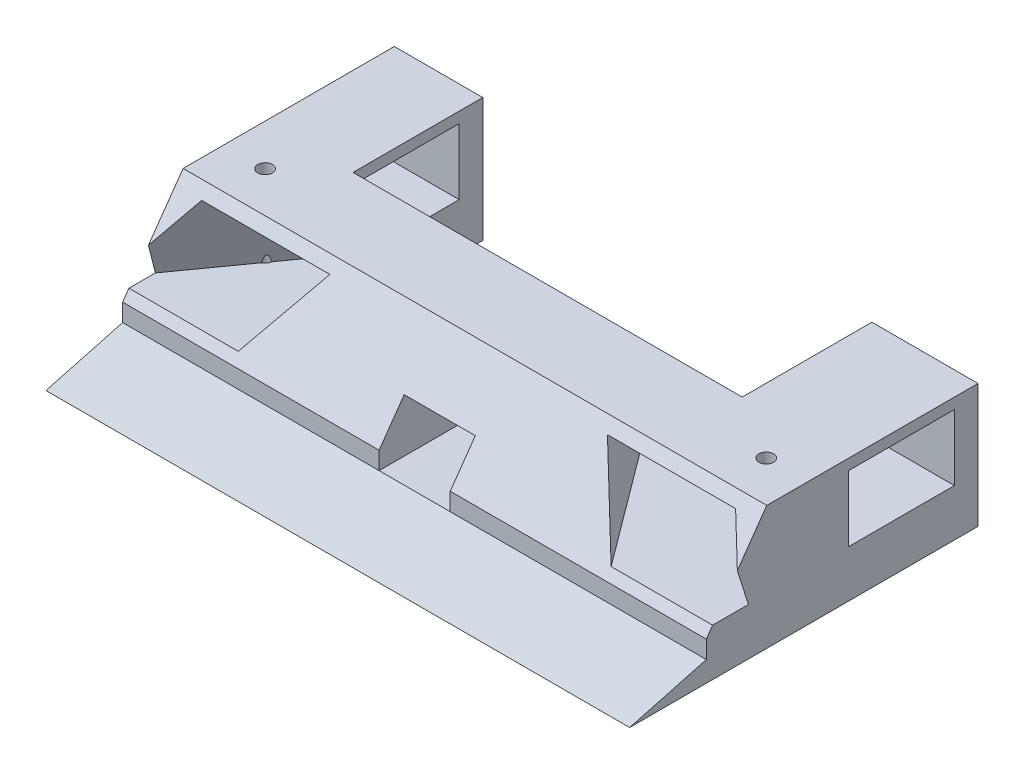
ISO-10303-21;
HEADER;
FILE_DESCRIPTION(('STEP AP214'),'2;1');
FILE_NAME('part.step','',(''),(''),'','','');
FILE_SCHEMA(('AUTOMOTIVE_DESIGN { 1 0 10303 214 1 1 1 1 }'));
ENDSEC;
DATA;
#1=APPLICATION_CONTEXT('core data for automotive mechanical design processes');
#2=APPLICATION_PROTOCOL_DEFINITION('international standard','automotive_design',2000,#1);
#3=PRODUCT_CONTEXT('',#1,'mechanical');
#4=PRODUCT('Part','Part','',(#3));
#5=PRODUCT_RELATED_PRODUCT_CATEGORY('part','',(#4));
#6=PRODUCT_DEFINITION_FORMATION('','',#4);
#7=PRODUCT_DEFINITION_CONTEXT('part definition',#1,'design');
#8=PRODUCT_DEFINITION('design','',#6,#7);
#9=PRODUCT_DEFINITION_SHAPE('','',#8);
#10=(LENGTH_UNIT() NAMED_UNIT(*) SI_UNIT(.MILLI.,.METRE.));
#11=(NAMED_UNIT(*) PLANE_ANGLE_UNIT() SI_UNIT($,.RADIAN.));
#12=(NAMED_UNIT(*) SI_UNIT($,.STERADIAN.) SOLID_ANGLE_UNIT());
#13=UNCERTAINTY_MEASURE_WITH_UNIT(LENGTH_MEASURE(1.E-05),#10,'distance_accuracy_value','');
#14=(GEOMETRIC_REPRESENTATION_CONTEXT(3) GLOBAL_UNCERTAINTY_ASSIGNED_CONTEXT((#13)) GLOBAL_UNIT_ASSIGNED_CONTEXT((#10,
#11,#12)) REPRESENTATION_CONTEXT('',''));
#15=CARTESIAN_POINT('',(0.,0.,0.));
#16=DIRECTION('',(0.,0.,1.));
#17=DIRECTION('',(1.,0.,0.));
#18=AXIS2_PLACEMENT_3D('',#15,#16,#17);
#19=CARTESIAN_POINT('',(-54.3252015837818,8.,0.));
#20=DIRECTION('',(0.,1.,0.));
#21=DIRECTION('',(0.,0.,1.));
#22=AXIS2_PLACEMENT_3D('',#19,#20,#21);
#23=PLANE('',#22);
#24=DIRECTION('',(-1.,0.,0.));
#25=VECTOR('',#24,1.);
#26=CARTESIAN_POINT('',(-54.3252015837818,8.,-3.05697282352726));
#27=LINE('',#26,#25);
#28=CARTESIAN_POINT('',(-19.3252015837818,7.99999999999999,-3.05697282352726));
#29=VERTEX_POINT('',#28);
#30=CARTESIAN_POINT('',(-39.3252015837818,8.,-3.05697282352726));
#31=VERTEX_POINT('',#30);
#32=EDGE_CURVE('E316',#29,#31,#27,.T.);
#33=ORIENTED_EDGE('',*,*,#32,.T.);
#34=DIRECTION('',(0.,0.,1.));
#35=VECTOR('',#34,1.);
#36=CARTESIAN_POINT('',(-39.3252015837818,8.,0.));
#37=LINE('',#36,#35);
#38=CARTESIAN_POINT('',(-39.3252015837818,8.,-21.0569728235272));
#39=VERTEX_POINT('',#38);
#40=EDGE_CURVE('E502',#39,#31,#37,.T.);
#41=ORIENTED_EDGE('',*,*,#40,.F.);
#42=DIRECTION('',(1.,0.,0.));
#43=VECTOR('',#42,1.);
#44=CARTESIAN_POINT('',(-54.3252015837818,8.,-21.0569728235272));
#45=LINE('',#44,#43);
#46=CARTESIAN_POINT('',(-54.3252015837818,8.,-21.0569728235272));
#47=VERTEX_POINT('',#46);
#48=EDGE_CURVE('E595',#47,#39,#45,.T.);
#49=ORIENTED_EDGE('',*,*,#48,.F.);
#50=DIRECTION('',(0.,0.,1.));
#51=VECTOR('',#50,1.);
#52=CARTESIAN_POINT('',(-54.3252015837818,8.,0.));
#53=LINE('',#52,#51);
#54=CARTESIAN_POINT('',(-54.3252015837818,8.,-3.05697282352725));
#55=VERTEX_POINT('',#54);
#56=EDGE_CURVE('E577',#47,#55,#53,.T.);
#57=ORIENTED_EDGE('',*,*,#56,.T.);
#58=DIRECTION('',(1.,0.,0.));
#59=VECTOR('',#58,1.);
#60=CARTESIAN_POINT('',(-54.3252015837818,8.,-3.05697282352725));
#61=LINE('',#60,#59);
#62=CARTESIAN_POINT('',(-41.0652015837818,7.99999999999999,-3.05697282352725));
#63=VERTEX_POINT('',#62);
#64=EDGE_CURVE('E599',#55,#63,#61,.T.);
#65=ORIENTED_EDGE('',*,*,#64,.T.);
#66=DIRECTION('',(-0.581711259945714,0.,0.81339535900592));
#67=VECTOR('',#66,1.);
#68=CARTESIAN_POINT('',(-41.0652015837818,7.99999999999999,-3.05697282352725));
#69=LINE('',#68,#67);
#70=CARTESIAN_POINT('',(-46.0846712022959,7.99999999999999,3.9616523492975));
#71=VERTEX_POINT('',#70);
#72=EDGE_CURVE('E523',#63,#71,#69,.T.);
#73=ORIENTED_EDGE('',*,*,#72,.T.);
#74=CARTESIAN_POINT('',(-47.3252015837818,8.,3.85625134071383));
#75=DIRECTION('',(0.,1.,0.));
#76=DIRECTION('',(0.,0.,1.));
#77=AXIS2_PLACEMENT_3D('',#74,#75,#76);
#78=CIRCLE('',#77,1.24500000000001);
#79=CARTESIAN_POINT('',(-46.8244890231637,7.99999999999999,4.99612498793937));
#80=VERTEX_POINT('',#79);
#81=EDGE_CURVE('E334',#80,#71,#78,.T.);
#82=ORIENTED_EDGE('',*,*,#81,.F.);
#83=CARTESIAN_POINT('',(-54.3252015837818,7.99999999999999,15.4842231323926));
#84=VERTEX_POINT('',#83);
#85=EDGE_CURVE('E541',#80,#84,#69,.T.);
#86=ORIENTED_EDGE('',*,*,#85,.T.);
#87=DIRECTION('',(0.,0.,1.));
#88=VECTOR('',#87,1.);
#89=CARTESIAN_POINT('',(-54.3252015837818,7.99999999999999,-25.0569728235273));
#90=LINE('',#89,#88);
#91=CARTESIAN_POINT('',(-54.3252015837818,7.99999999999999,19.955432572522));
#92=VERTEX_POINT('',#91);
#93=EDGE_CURVE('E534',#84,#92,#90,.T.);
#94=ORIENTED_EDGE('',*,*,#93,.T.);
#95=DIRECTION('',(1.,0.,0.));
#96=VECTOR('',#95,1.);
#97=CARTESIAN_POINT('',(-41.0652015837818,7.99999999999999,19.955432572522));
#98=LINE('',#97,#96);
#99=CARTESIAN_POINT('',(-35.7828506090695,7.99999999999999,19.955432572522));
#100=VERTEX_POINT('',#99);
#101=EDGE_CURVE('E531',#92,#100,#98,.T.);
#102=ORIENTED_EDGE('',*,*,#101,.T.);
#103=DIRECTION('',(-0.581711259945714,0.,0.81339535900592));
#104=VECTOR('',#103,1.);
#105=CARTESIAN_POINT('',(-19.3252015837818,7.99999999999999,-3.05697282352726));
#106=LINE('',#105,#104);
#107=EDGE_CURVE('E505',#29,#100,#106,.T.);
#108=ORIENTED_EDGE('',*,*,#107,.F.);
#109=EDGE_LOOP('',(#33,#41,#49,#57,#65,#73,#82,#86,#94,#102,#108));
#110=FACE_BOUND('',#109,.T.);
#111=ADVANCED_FACE('F45',(#110),#23,.T.);
#112=CARTESIAN_POINT('',(0.,0.,0.));
#113=DIRECTION('',(0.,1.,0.));
#114=DIRECTION('',(0.,0.,1.));
#115=AXIS2_PLACEMENT_3D('',#112,#113,#114);
#116=PLANE('',#115);
#117=CARTESIAN_POINT('',(37.6747984162182,0.,3.85625134071382));
#118=DIRECTION('',(0.,1.,0.));
#119=DIRECTION('',(0.,0.,1.));
#120=AXIS2_PLACEMENT_3D('',#117,#118,#119);
#121=CIRCLE('',#120,1.24500000000001);
#122=CARTESIAN_POINT('',(37.6747984162182,0.,5.10125134071383));
#123=VERTEX_POINT('',#122);
#124=EDGE_CURVE('E326',#123,#123,#121,.T.);
#125=ORIENTED_EDGE('',*,*,#124,.T.);
#126=EDGE_LOOP('',(#125));
#127=FACE_BOUND('',#126,.T.);
#128=CARTESIAN_POINT('',(-47.3252015837818,0.,3.85625134071383));
#129=DIRECTION('',(0.,1.,0.));
#130=DIRECTION('',(0.,0.,1.));
#131=AXIS2_PLACEMENT_3D('',#128,#129,#130);
#132=CIRCLE('',#131,1.24500000000001);
#133=CARTESIAN_POINT('',(-47.3252015837818,0.,5.10125134071384));
#134=VERTEX_POINT('',#133);
#135=EDGE_CURVE('E337',#134,#134,#132,.T.);
#136=ORIENTED_EDGE('',*,*,#135,.T.);
#137=EDGE_LOOP('',(#136));
#138=FACE_BOUND('',#137,.T.);
#139=DIRECTION('',(0.,0.,-1.));
#140=VECTOR('',#139,1.);
#141=CARTESIAN_POINT('',(-39.3252015837818,0.,-10.0569728235273));
#142=LINE('',#141,#140);
#143=CARTESIAN_POINT('',(-39.3252015837818,0.,-3.05697282352726));
#144=VERTEX_POINT('',#143);
#145=CARTESIAN_POINT('',(-39.3252015837818,0.,-25.0569728235273));
#146=VERTEX_POINT('',#145);
#147=EDGE_CURVE('E306',#144,#146,#142,.T.);
#148=ORIENTED_EDGE('',*,*,#147,.F.);
#149=DIRECTION('',(-1.,0.,0.));
#150=VECTOR('',#149,1.);
#151=CARTESIAN_POINT('',(0.,0.,-3.05697282352726));
#152=LINE('',#151,#150);
#153=CARTESIAN_POINT('',(26.6747984162182,0.,-3.05697282352726));
#154=VERTEX_POINT('',#153);
#155=EDGE_CURVE('E296',#154,#144,#152,.T.);
#156=ORIENTED_EDGE('',*,*,#155,.F.);
#157=DIRECTION('',(0.,0.,1.));
#158=VECTOR('',#157,1.);
#159=CARTESIAN_POINT('',(26.6747984162182,0.,-25.0569728235273));
#160=LINE('',#159,#158);
#161=CARTESIAN_POINT('',(26.6747984162182,0.,-25.0569728235273));
#162=VERTEX_POINT('',#161);
#163=EDGE_CURVE('E274',#162,#154,#160,.T.);
#164=ORIENTED_EDGE('',*,*,#163,.F.);
#165=DIRECTION('',(-1.,0.,0.));
#166=VECTOR('',#165,1.);
#167=CARTESIAN_POINT('',(26.6747984162182,0.,-25.0569728235273));
#168=LINE('',#167,#166);
#169=CARTESIAN_POINT('',(44.6747984162182,0.,-25.0569728235273));
#170=VERTEX_POINT('',#169);
#171=EDGE_CURVE('E288',#170,#162,#168,.T.);
#172=ORIENTED_EDGE('',*,*,#171,.F.);
#173=DIRECTION('',(0.,0.,-1.));
#174=VECTOR('',#173,1.);
#175=CARTESIAN_POINT('',(44.6747984162182,0.,-25.0569728235273));
#176=LINE('',#175,#174);
#177=CARTESIAN_POINT('',(44.6748009162182,0.,34.0243667668981));
#178=VERTEX_POINT('',#177);
#179=EDGE_CURVE('E421',#178,#170,#176,.T.);
#180=ORIENTED_EDGE('',*,*,#179,.F.);
#181=DIRECTION('',(1.,0.,0.));
#182=VECTOR('',#181,1.);
#183=CARTESIAN_POINT('',(-54.3252265837818,0.,34.0243667668981));
#184=LINE('',#183,#182);
#185=CARTESIAN_POINT('',(-54.3252040837818,0.,34.0243667668981));
#186=VERTEX_POINT('',#185);
#187=EDGE_CURVE('E394',#186,#178,#184,.T.);
#188=ORIENTED_EDGE('',*,*,#187,.F.);
#189=DIRECTION('',(0.,0.,1.));
#190=VECTOR('',#189,1.);
#191=CARTESIAN_POINT('',(-54.3252015837818,0.,-25.0569728235273));
#192=LINE('',#191,#190);
#193=CARTESIAN_POINT('',(-54.3252015837818,0.,-25.0569728235273));
#194=VERTEX_POINT('',#193);
#195=EDGE_CURVE('E423',#194,#186,#192,.T.);
#196=ORIENTED_EDGE('',*,*,#195,.F.);
#197=DIRECTION('',(-1.,0.,0.));
#198=VECTOR('',#197,1.);
#199=CARTESIAN_POINT('',(-54.3252015837818,0.,-25.0569728235273));
#200=LINE('',#199,#198);
#201=EDGE_CURVE('E287',#146,#194,#200,.T.);
#202=ORIENTED_EDGE('',*,*,#201,.F.);
#203=EDGE_LOOP('',(#148,#156,#164,#172,#180,#188,#196,#202));
#204=FACE_BOUND('',#203,.T.);
#205=ADVANCED_FACE('F304',(#127,#138,#204),#116,.F.);
#206=DIRECTION('',(0.,0.,1.));
#207=VECTOR('',#206,1.);
#208=CARTESIAN_POINT('',(26.6747984162182,8.,-25.0569728235273));
#209=LINE('',#208,#207);
#210=CARTESIAN_POINT('',(26.6747984162182,8.,-21.0569728235273));
#211=VERTEX_POINT('',#210);
#212=CARTESIAN_POINT('',(26.6747984162182,8.,-3.05697282352726));
#213=VERTEX_POINT('',#212);
#214=EDGE_CURVE('E613',#211,#213,#209,.T.);
#215=ORIENTED_EDGE('',*,*,#214,.T.);
#216=DIRECTION('',(-1.,0.,0.));
#217=VECTOR('',#216,1.);
#218=CARTESIAN_POINT('',(-54.3252015837818,8.,-3.05697282352726));
#219=LINE('',#218,#217);
#220=CARTESIAN_POINT('',(10.3104845348903,8.,-3.05697282352726));
#221=VERTEX_POINT('',#220);
#222=EDGE_CURVE('E299',#213,#221,#219,.T.);
#223=ORIENTED_EDGE('',*,*,#222,.T.);
#224=DIRECTION('',(0.597532641120102,0.,0.801844587682697));
#225=VECTOR('',#224,1.);
#226=CARTESIAN_POINT('',(10.3104845348903,7.99999999999999,-3.05697282352726));
#227=LINE('',#226,#225);
#228=CARTESIAN_POINT('',(27.4592731979986,7.99999999999999,19.955432572522));
#229=VERTEX_POINT('',#228);
#230=EDGE_CURVE('E673',#221,#229,#227,.T.);
#231=ORIENTED_EDGE('',*,*,#230,.T.);
#232=DIRECTION('',(1.,0.,0.));
#233=VECTOR('',#232,1.);
#234=CARTESIAN_POINT('',(32.0504845348903,7.99999999999999,19.955432572522));
#235=LINE('',#234,#233);
#236=CARTESIAN_POINT('',(44.6747984162182,7.99999999999999,19.955432572522));
#237=VERTEX_POINT('',#236);
#238=EDGE_CURVE('E666',#229,#237,#235,.T.);
#239=ORIENTED_EDGE('',*,*,#238,.T.);
#240=DIRECTION('',(0.,0.,-1.));
#241=VECTOR('',#240,1.);
#242=CARTESIAN_POINT('',(44.6747984162182,7.99999999999999,-25.0569728235273));
#243=LINE('',#242,#241);
#244=CARTESIAN_POINT('',(44.6747984162182,8.,13.8839222210929));
#245=VERTEX_POINT('',#244);
#246=EDGE_CURVE('E549',#237,#245,#243,.T.);
#247=ORIENTED_EDGE('',*,*,#246,.T.);
#248=DIRECTION('',(0.597532641120102,0.,0.801844587682697));
#249=VECTOR('',#248,1.);
#250=CARTESIAN_POINT('',(32.0504845348903,7.99999999999999,-3.05697282352727));
#251=LINE('',#250,#249);
#252=CARTESIAN_POINT('',(38.0795707002953,7.99999999999999,5.03361466528402));
#253=VERTEX_POINT('',#252);
#254=EDGE_CURVE('E679',#253,#245,#251,.T.);
#255=ORIENTED_EDGE('',*,*,#254,.F.);
#256=CARTESIAN_POINT('',(37.6747984162182,8.,3.85625134071382));
#257=DIRECTION('',(0.,1.,0.));
#258=DIRECTION('',(0.,0.,1.));
#259=AXIS2_PLACEMENT_3D('',#256,#257,#258);
#260=CIRCLE('',#259,1.24500000000001);
#261=CARTESIAN_POINT('',(36.6623104418281,7.99999999999999,3.13175627398429));
#262=VERTEX_POINT('',#261);
#263=EDGE_CURVE('E323',#262,#253,#260,.T.);
#264=ORIENTED_EDGE('',*,*,#263,.F.);
#265=CARTESIAN_POINT('',(32.0504845348903,7.99999999999999,-3.05697282352727));
#266=VERTEX_POINT('',#265);
#267=EDGE_CURVE('E676',#266,#262,#251,.T.);
#268=ORIENTED_EDGE('',*,*,#267,.F.);
#269=CARTESIAN_POINT('',(44.6747984162182,8.,-3.05697282352727));
#270=VERTEX_POINT('',#269);
#271=EDGE_CURVE('E603',#266,#270,#61,.T.);
#272=ORIENTED_EDGE('',*,*,#271,.T.);
#273=DIRECTION('',(0.,0.,1.));
#274=VECTOR('',#273,1.);
#275=CARTESIAN_POINT('',(44.6747984162182,8.,0.));
#276=LINE('',#275,#274);
#277=CARTESIAN_POINT('',(44.6747984162182,8.,-21.0569728235273));
#278=VERTEX_POINT('',#277);
#279=EDGE_CURVE('E570',#278,#270,#276,.T.);
#280=ORIENTED_EDGE('',*,*,#279,.F.);
#281=EDGE_CURVE('E598',#211,#278,#45,.T.);
#282=ORIENTED_EDGE('',*,*,#281,.F.);
#283=EDGE_LOOP('',(#215,#223,#231,#239,#247,#255,#264,#268,#272,#280,#282));
#284=FACE_BOUND('',#283,.T.);
#285=ADVANCED_FACE('F623',(#284),#23,.T.);
#286=CARTESIAN_POINT('',(-54.3252015837818,19.1720710321592,0.));
#287=DIRECTION('',(0.,-1.,0.));
#288=DIRECTION('',(0.,0.,-1.));
#289=AXIS2_PLACEMENT_3D('',#286,#287,#288);
#290=PLANE('',#289);
#291=DIRECTION('',(0.,0.,-1.));
#292=VECTOR('',#291,1.);
#293=CARTESIAN_POINT('',(-39.3252015837818,19.1720710321592,0.));
#294=LINE('',#293,#292);
#295=CARTESIAN_POINT('',(-39.3252015837818,19.1720710321592,-3.05697282352726));
#296=VERTEX_POINT('',#295);
#297=CARTESIAN_POINT('',(-39.3252015837818,19.1720710321592,-21.0569728235273));
#298=VERTEX_POINT('',#297);
#299=EDGE_CURVE('E452',#296,#298,#294,.T.);
#300=ORIENTED_EDGE('',*,*,#299,.F.);
#301=DIRECTION('',(1.,0.,0.));
#302=VECTOR('',#301,1.);
#303=CARTESIAN_POINT('',(-54.3252015837818,19.1720710321592,-3.05697282352725));
#304=LINE('',#303,#302);
#305=CARTESIAN_POINT('',(-54.3252015837818,19.1720710321592,-3.05697282352725));
#306=VERTEX_POINT('',#305);
#307=EDGE_CURVE('E604',#306,#296,#304,.T.);
#308=ORIENTED_EDGE('',*,*,#307,.F.);
#309=DIRECTION('',(0.,0.,-1.));
#310=VECTOR('',#309,1.);
#311=CARTESIAN_POINT('',(-54.3252015837818,19.1720710321592,0.));
#312=LINE('',#311,#310);
#313=CARTESIAN_POINT('',(-54.3252015837818,19.1720710321592,-21.0569728235272));
#314=VERTEX_POINT('',#313);
#315=EDGE_CURVE('E569',#306,#314,#312,.T.);
#316=ORIENTED_EDGE('',*,*,#315,.T.);
#317=DIRECTION('',(1.,0.,0.));
#318=VECTOR('',#317,1.);
#319=CARTESIAN_POINT('',(-54.3252015837818,19.1720710321592,-21.0569728235272));
#320=LINE('',#319,#318);
#321=EDGE_CURVE('E608',#314,#298,#320,.T.);
#322=ORIENTED_EDGE('',*,*,#321,.T.);
#323=EDGE_LOOP('',(#300,#308,#316,#322));
#324=FACE_BOUND('',#323,.T.);
#325=ADVANCED_FACE('F761',(#324),#290,.T.);
#326=DIRECTION('',(-0.581711259945714,0.,0.81339535900592));
#327=VECTOR('',#326,1.);
#328=CARTESIAN_POINT('',(-39.0652015837818,19.1720710321592,-3.05697282352725));
#329=LINE('',#328,#327);
#330=CARTESIAN_POINT('',(-39.0652015837818,19.1720710321592,-3.05697282352726));
#331=VERTEX_POINT('',#330);
#332=CARTESIAN_POINT('',(-49.8771151126521,19.1720710321592,12.0611121988894));
#333=VERTEX_POINT('',#332);
#334=EDGE_CURVE('E546',#331,#333,#329,.T.);
#335=ORIENTED_EDGE('',*,*,#334,.F.);
#336=DIRECTION('',(1.,0.,0.));
#337=VECTOR('',#336,1.);
#338=CARTESIAN_POINT('',(-54.3252015837818,19.1720710321592,-3.05697282352726));
#339=LINE('',#338,#337);
#340=CARTESIAN_POINT('',(-17.3252015837818,19.1720710321592,-3.05697282352726));
#341=VERTEX_POINT('',#340);
#342=EDGE_CURVE('E309',#331,#341,#339,.T.);
#343=ORIENTED_EDGE('',*,*,#342,.T.);
#344=DIRECTION('',(-0.581711259945714,0.,0.81339535900592));
#345=VECTOR('',#344,1.);
#346=CARTESIAN_POINT('',(-17.3252015837818,19.1720710321592,-3.05697282352726));
#347=LINE('',#346,#345);
#348=CARTESIAN_POINT('',(-28.1371151126521,19.1720710321592,12.0611121988894));
#349=VERTEX_POINT('',#348);
#350=EDGE_CURVE('E514',#341,#349,#347,.T.);
#351=ORIENTED_EDGE('',*,*,#350,.T.);
#352=DIRECTION('',(-1.,0.,0.));
#353=VECTOR('',#352,1.);
#354=CARTESIAN_POINT('',(-17.3252015837818,19.1720710321592,12.0611121988894));
#355=LINE('',#354,#353);
#356=EDGE_CURVE('E521',#349,#333,#355,.T.);
#357=ORIENTED_EDGE('',*,*,#356,.T.);
#358=EDGE_LOOP('',(#335,#343,#351,#357));
#359=FACE_BOUND('',#358,.T.);
#360=ADVANCED_FACE('F752',(#359),#290,.T.);
#361=CARTESIAN_POINT('',(7.67479841621819,19.1720710321592,-3.05697282352726));
#362=VERTEX_POINT('',#361);
#363=CARTESIAN_POINT('',(26.6747984162182,19.1720710321592,-3.05697282352726));
#364=VERTEX_POINT('',#363);
#365=EDGE_CURVE('E318',#362,#364,#339,.T.);
#366=ORIENTED_EDGE('',*,*,#365,.T.);
#367=DIRECTION('',(0.,0.,-1.));
#368=VECTOR('',#367,1.);
#369=CARTESIAN_POINT('',(26.6747984162182,19.1720710321592,-25.0569728235273));
#370=LINE('',#369,#368);
#371=CARTESIAN_POINT('',(26.6747984162182,19.1720710321592,-21.0569728235273));
#372=VERTEX_POINT('',#371);
#373=EDGE_CURVE('E483',#364,#372,#370,.T.);
#374=ORIENTED_EDGE('',*,*,#373,.T.);
#375=CARTESIAN_POINT('',(44.6747984162182,19.1720710321592,-21.0569728235273));
#376=VERTEX_POINT('',#375);
#377=EDGE_CURVE('E580',#372,#376,#320,.T.);
#378=ORIENTED_EDGE('',*,*,#377,.T.);
#379=DIRECTION('',(0.,0.,-1.));
#380=VECTOR('',#379,1.);
#381=CARTESIAN_POINT('',(44.6747984162182,19.1720710321592,0.));
#382=LINE('',#381,#380);
#383=CARTESIAN_POINT('',(44.6747984162182,19.1720710321592,-3.05697282352727));
#384=VERTEX_POINT('',#383);
#385=EDGE_CURVE('E584',#384,#376,#382,.T.);
#386=ORIENTED_EDGE('',*,*,#385,.F.);
#387=CARTESIAN_POINT('',(29.4147984162182,19.1720710321592,-3.05697282352727));
#388=VERTEX_POINT('',#387);
#389=EDGE_CURVE('E607',#388,#384,#304,.T.);
#390=ORIENTED_EDGE('',*,*,#389,.F.);
#391=DIRECTION('',(0.597532641120102,0.,0.801844587682697));
#392=VECTOR('',#391,1.);
#393=CARTESIAN_POINT('',(29.4147984162182,19.1720710321592,-3.05697282352727));
#394=LINE('',#393,#392);
#395=CARTESIAN_POINT('',(40.6807586919239,19.1720710321592,12.0611121988894));
#396=VERTEX_POINT('',#395);
#397=EDGE_CURVE('E642',#388,#396,#394,.T.);
#398=ORIENTED_EDGE('',*,*,#397,.T.);
#399=DIRECTION('',(-1.,0.,0.));
#400=VECTOR('',#399,1.);
#401=CARTESIAN_POINT('',(7.6747984162182,19.1720710321592,12.0611121988894));
#402=LINE('',#401,#400);
#403=CARTESIAN_POINT('',(18.9407586919239,19.1720710321592,12.0611121988894));
#404=VERTEX_POINT('',#403);
#405=EDGE_CURVE('E644',#396,#404,#402,.T.);
#406=ORIENTED_EDGE('',*,*,#405,.T.);
#407=DIRECTION('',(0.597532641120102,0.,0.801844587682697));
#408=VECTOR('',#407,1.);
#409=CARTESIAN_POINT('',(7.67479841621819,19.1720710321592,-3.05697282352726));
#410=LINE('',#409,#408);
#411=EDGE_CURVE('E649',#362,#404,#410,.T.);
#412=ORIENTED_EDGE('',*,*,#411,.F.);
#413=EDGE_LOOP('',(#366,#374,#378,#386,#390,#398,#406,#412));
#414=FACE_BOUND('',#413,.T.);
#415=ADVANCED_FACE('F630',(#414),#290,.T.);
#416=CARTESIAN_POINT('',(-10.8252015837818,3.48333950160451,-25.0569978235273));
#417=DIRECTION('',(-1.,0.,0.));
#418=DIRECTION('',(0.,0.,1.));
#419=AXIS2_PLACEMENT_3D('',#416,#417,#418);
#420=PLANE('',#419);
#421=DIRECTION('',(0.,0.,1.));
#422=VECTOR('',#421,1.);
#423=CARTESIAN_POINT('',(-10.8252015837818,3.48333950160451,-25.0569978235273));
#424=LINE('',#423,#422);
#425=CARTESIAN_POINT('',(-10.8252015837818,3.48333950160451,-3.05697282352726));
#426=VERTEX_POINT('',#425);
#427=CARTESIAN_POINT('',(-10.8252015837818,3.48333950160451,21.0243667668981));
#428=VERTEX_POINT('',#427);
#429=EDGE_CURVE('E359',#426,#428,#424,.T.);
#430=ORIENTED_EDGE('',*,*,#429,.F.);
#431=DIRECTION('',(0.,-1.,0.));
#432=VECTOR('',#431,1.);
#433=CARTESIAN_POINT('',(-10.8252015837818,0.,-3.05697282352726));
#434=LINE('',#433,#432);
#435=CARTESIAN_POINT('',(-10.8252015837818,12.5133395016045,-3.05697282352726));
#436=VERTEX_POINT('',#435);
#437=EDGE_CURVE('E61',#436,#426,#434,.T.);
#438=ORIENTED_EDGE('',*,*,#437,.F.);
#439=DIRECTION('',(0.,0.,1.));
#440=VECTOR('',#439,1.);
#441=CARTESIAN_POINT('',(-10.8252015837818,12.5133395016045,-25.0569978235273));
#442=LINE('',#441,#440);
#443=CARTESIAN_POINT('',(-10.8252015837818,12.5133395016045,16.7662523499763));
#444=VERTEX_POINT('',#443);
#445=EDGE_CURVE('E363',#436,#444,#442,.T.);
#446=ORIENTED_EDGE('',*,*,#445,.T.);
#447=DIRECTION('',(0.,-0.81668699066629,0.577080894915469));
#448=VECTOR('',#447,1.);
#449=CARTESIAN_POINT('',(-10.8252015837818,12.0690636813601,17.080183012355));
#450=LINE('',#449,#448);
#451=CARTESIAN_POINT('',(-10.8252015837818,6.48724042310705,21.0243667668981));
#452=VERTEX_POINT('',#451);
#453=EDGE_CURVE('E386',#444,#452,#450,.T.);
#454=ORIENTED_EDGE('',*,*,#453,.T.);
#455=DIRECTION('',(0.,-1.,0.));
#456=VECTOR('',#455,1.);
#457=CARTESIAN_POINT('',(-10.8252015837818,0.,21.0243667668981));
#458=LINE('',#457,#456);
#459=EDGE_CURVE('E382',#452,#428,#458,.T.);
#460=ORIENTED_EDGE('',*,*,#459,.T.);
#461=EDGE_LOOP('',(#430,#438,#446,#454,#460));
#462=FACE_BOUND('',#461,.T.);
#463=ADVANCED_FACE('F790',(#462),#420,.F.);
#464=CARTESIAN_POINT('',(1.23479841621819,3.48333950160451,-25.0569978235273));
#465=DIRECTION('',(1.,0.,0.));
#466=DIRECTION('',(0.,0.,-1.));
#467=AXIS2_PLACEMENT_3D('',#464,#465,#466);
#468=PLANE('',#467);
#469=DIRECTION('',(0.,1.,0.));
#470=VECTOR('',#469,1.);
#471=CARTESIAN_POINT('',(1.23479841621819,0.,-3.05697282352726));
#472=LINE('',#471,#470);
#473=CARTESIAN_POINT('',(1.23479841621819,3.48333950160451,-3.05697282352726));
#474=VERTEX_POINT('',#473);
#475=CARTESIAN_POINT('',(1.23479841621819,12.5133395016045,-3.05697282352726));
#476=VERTEX_POINT('',#475);
#477=EDGE_CURVE('E378',#474,#476,#472,.T.);
#478=ORIENTED_EDGE('',*,*,#477,.F.);
#479=DIRECTION('',(0.,0.,1.));
#480=VECTOR('',#479,1.);
#481=CARTESIAN_POINT('',(1.23479841621819,3.48333950160451,-25.0569978235273));
#482=LINE('',#481,#480);
#483=CARTESIAN_POINT('',(1.23479841621819,3.48333950160451,21.0243667668981));
#484=VERTEX_POINT('',#483);
#485=EDGE_CURVE('E358',#474,#484,#482,.T.);
#486=ORIENTED_EDGE('',*,*,#485,.T.);
#487=DIRECTION('',(0.,1.,0.));
#488=VECTOR('',#487,1.);
#489=CARTESIAN_POINT('',(1.23479841621819,0.,21.0243667668981));
#490=LINE('',#489,#488);
#491=CARTESIAN_POINT('',(1.23479841621819,6.48724042310705,21.0243667668981));
#492=VERTEX_POINT('',#491);
#493=EDGE_CURVE('E362',#484,#492,#490,.T.);
#494=ORIENTED_EDGE('',*,*,#493,.T.);
#495=DIRECTION('',(0.,0.81668699066629,-0.577080894915469));
#496=VECTOR('',#495,1.);
#497=CARTESIAN_POINT('',(1.23479841621819,12.0690636813601,17.080183012355));
#498=LINE('',#497,#496);
#499=CARTESIAN_POINT('',(1.23479841621819,12.5133395016045,16.7662523499763));
#500=VERTEX_POINT('',#499);
#501=EDGE_CURVE('E375',#492,#500,#498,.T.);
#502=ORIENTED_EDGE('',*,*,#501,.T.);
#503=DIRECTION('',(0.,0.,1.));
#504=VECTOR('',#503,1.);
#505=CARTESIAN_POINT('',(1.23479841621819,12.5133395016045,-25.0569978235273));
#506=LINE('',#505,#504);
#507=EDGE_CURVE('E367',#476,#500,#506,.T.);
#508=ORIENTED_EDGE('',*,*,#507,.F.);
#509=EDGE_LOOP('',(#478,#486,#494,#502,#508));
#510=FACE_BOUND('',#509,.T.);
#511=ADVANCED_FACE('F794',(#510),#468,.F.);
#512=CARTESIAN_POINT('',(-4.8252015837818,3.48333950160451,-25.0569978235273));
#513=DIRECTION('',(0.,-1.,0.));
#514=DIRECTION('',(1.,0.,0.));
#515=AXIS2_PLACEMENT_3D('',#512,#513,#514);
#516=PLANE('',#515);
#517=DIRECTION('',(1.,0.,0.));
#518=VECTOR('',#517,1.);
#519=CARTESIAN_POINT('',(-4.8252015837818,3.48333950160451,-3.05697282352726));
#520=LINE('',#519,#518);
#521=EDGE_CURVE('E489',#426,#474,#520,.T.);
#522=ORIENTED_EDGE('',*,*,#521,.F.);
#523=ORIENTED_EDGE('',*,*,#429,.T.);
#524=DIRECTION('',(1.,0.,0.));
#525=VECTOR('',#524,1.);
#526=CARTESIAN_POINT('',(-54.3252265837818,3.48333950160451,21.0243667668981));
#527=LINE('',#526,#525);
#528=EDGE_CURVE('E400',#428,#484,#527,.T.);
#529=ORIENTED_EDGE('',*,*,#528,.T.);
#530=ORIENTED_EDGE('',*,*,#485,.F.);
#531=EDGE_LOOP('',(#522,#523,#529,#530));
#532=FACE_BOUND('',#531,.T.);
#533=ADVANCED_FACE('F474',(#532),#516,.F.);
#534=CARTESIAN_POINT('',(-54.3253415837818,21.,0.));
#535=DIRECTION('',(0.,1.,0.));
#536=DIRECTION('',(0.,0.,1.));
#537=AXIS2_PLACEMENT_3D('',#534,#535,#536);
#538=PLANE('',#537);
#539=CARTESIAN_POINT('',(-47.3252015837818,21.,3.85625134071383));
#540=DIRECTION('',(0.,1.,0.));
#541=DIRECTION('',(0.,0.,1.));
#542=AXIS2_PLACEMENT_3D('',#539,#540,#541);
#543=CIRCLE('',#542,1.24500000000001);
#544=CARTESIAN_POINT('',(-47.3252015837818,21.,5.10125134071384));
#545=VERTEX_POINT('',#544);
#546=EDGE_CURVE('E330',#545,#545,#543,.T.);
#547=ORIENTED_EDGE('',*,*,#546,.F.);
#548=EDGE_LOOP('',(#547));
#549=FACE_BOUND('',#548,.T.);
#550=CARTESIAN_POINT('',(37.6747984162182,21.,3.85625134071382));
#551=DIRECTION('',(0.,1.,0.));
#552=DIRECTION('',(0.,0.,1.));
#553=AXIS2_PLACEMENT_3D('',#550,#551,#552);
#554=CIRCLE('',#553,1.24500000000001);
#555=CARTESIAN_POINT('',(37.6747984162182,21.,5.10125134071383));
#556=VERTEX_POINT('',#555);
#557=EDGE_CURVE('E308',#556,#556,#554,.T.);
#558=ORIENTED_EDGE('',*,*,#557,.F.);
#559=EDGE_LOOP('',(#558));
#560=FACE_BOUND('',#559,.T.);
#561=DIRECTION('',(-1.,0.,0.));
#562=VECTOR('',#561,1.);
#563=CARTESIAN_POINT('',(-54.3253415837818,21.,-3.05697282352726));
#564=LINE('',#563,#562);
#565=CARTESIAN_POINT('',(26.6747984162182,21.,-3.05697282352726));
#566=VERTEX_POINT('',#565);
#567=CARTESIAN_POINT('',(-39.3252015837818,21.,-3.05697282352726));
#568=VERTEX_POINT('',#567);
#569=EDGE_CURVE('E11',#566,#568,#564,.T.);
#570=ORIENTED_EDGE('',*,*,#569,.T.);
#571=DIRECTION('',(0.,0.,-1.));
#572=VECTOR('',#571,1.);
#573=CARTESIAN_POINT('',(-39.3252015837818,21.,-10.0569728235273));
#574=LINE('',#573,#572);
#575=CARTESIAN_POINT('',(-39.3252015837818,21.,-25.0569728235273));
#576=VERTEX_POINT('',#575);
#577=EDGE_CURVE('E54',#568,#576,#574,.T.);
#578=ORIENTED_EDGE('',*,*,#577,.T.);
#579=DIRECTION('',(1.,0.,0.));
#580=VECTOR('',#579,1.);
#581=CARTESIAN_POINT('',(-54.3253415837818,21.,-25.0569728235273));
#582=LINE('',#581,#580);
#583=CARTESIAN_POINT('',(-54.3252015837818,21.,-25.0569728235273));
#584=VERTEX_POINT('',#583);
#585=EDGE_CURVE('E346',#584,#576,#582,.T.);
#586=ORIENTED_EDGE('',*,*,#585,.F.);
#587=DIRECTION('',(0.,0.,1.));
#588=VECTOR('',#587,1.);
#589=CARTESIAN_POINT('',(-54.3252015837818,21.,-25.0569728235273));
#590=LINE('',#589,#588);
#591=CARTESIAN_POINT('',(-54.3252015837818,21.,10.7694755049549));
#592=VERTEX_POINT('',#591);
#593=EDGE_CURVE('E352',#584,#592,#590,.T.);
#594=ORIENTED_EDGE('',*,*,#593,.T.);
#595=DIRECTION('',(1.,0.,0.));
#596=VECTOR('',#595,1.);
#597=CARTESIAN_POINT('',(-54.3253415837818,21.,10.7694755049549));
#598=LINE('',#597,#596);
#599=CARTESIAN_POINT('',(44.6747984162182,21.,10.7694755049549));
#600=VERTEX_POINT('',#599);
#601=EDGE_CURVE('E342',#592,#600,#598,.T.);
#602=ORIENTED_EDGE('',*,*,#601,.T.);
#603=DIRECTION('',(0.,0.,-1.));
#604=VECTOR('',#603,1.);
#605=CARTESIAN_POINT('',(44.6747984162182,21.,-25.0569728235273));
#606=LINE('',#605,#604);
#607=CARTESIAN_POINT('',(44.6747984162182,21.,-25.0569728235273));
#608=VERTEX_POINT('',#607);
#609=EDGE_CURVE('E355',#600,#608,#606,.T.);
#610=ORIENTED_EDGE('',*,*,#609,.T.);
#611=CARTESIAN_POINT('',(26.6747984162182,21.,-25.0569728235273));
#612=VERTEX_POINT('',#611);
#613=EDGE_CURVE('E341',#612,#608,#582,.T.);
#614=ORIENTED_EDGE('',*,*,#613,.F.);
#615=DIRECTION('',(0.,0.,1.));
#616=VECTOR('',#615,1.);
#617=CARTESIAN_POINT('',(26.6747984162182,21.,-25.0569728235273));
#618=LINE('',#617,#616);
#619=EDGE_CURVE('E345',#612,#566,#618,.T.);
#620=ORIENTED_EDGE('',*,*,#619,.T.);
#621=EDGE_LOOP('',(#570,#578,#586,#594,#602,#610,#614,#620));
#622=FACE_BOUND('',#621,.T.);
#623=ADVANCED_FACE('F470',(#549,#560,#622),#538,.T.);
#624=CARTESIAN_POINT('',(44.6747984162182,25.,-25.0569728235273));
#625=DIRECTION('',(-1.,0.,0.));
#626=DIRECTION('',(0.,0.,1.));
#627=AXIS2_PLACEMENT_3D('',#624,#625,#626);
#628=PLANE('',#627);
#629=DIRECTION('',(0.,-1.,0.));
#630=VECTOR('',#629,1.);
#631=CARTESIAN_POINT('',(44.6747984162182,0.,-21.0569728235273));
#632=LINE('',#631,#630);
#633=EDGE_CURVE('E552',#376,#278,#632,.T.);
#634=ORIENTED_EDGE('',*,*,#633,.T.);
#635=ORIENTED_EDGE('',*,*,#279,.T.);
#636=DIRECTION('',(0.,-1.,0.));
#637=VECTOR('',#636,1.);
#638=CARTESIAN_POINT('',(44.6747984162182,0.,-3.05697282352727));
#639=LINE('',#638,#637);
#640=EDGE_CURVE('E588',#384,#270,#639,.T.);
#641=ORIENTED_EDGE('',*,*,#640,.F.);
#642=ORIENTED_EDGE('',*,*,#385,.T.);
#643=EDGE_LOOP('',(#634,#635,#641,#642));
#644=FACE_BOUND('',#643,.T.);
#645=ORIENTED_EDGE('',*,*,#609,.F.);
#646=DIRECTION('',(0.,-0.81668699066629,0.577080894915469));
#647=VECTOR('',#646,1.);
#648=CARTESIAN_POINT('',(44.6747984162182,12.0690636813601,17.080183012355));
#649=LINE('',#648,#647);
#650=CARTESIAN_POINT('',(44.6747984162182,13.933869527277,15.7624886708212));
#651=VERTEX_POINT('',#650);
#652=EDGE_CURVE('E558',#600,#651,#649,.T.);
#653=ORIENTED_EDGE('',*,*,#652,.T.);
#654=DIRECTION('',(0.,0.953364983714657,0.301819826762179));
#655=VECTOR('',#654,1.);
#656=CARTESIAN_POINT('',(44.6747984162182,12.2463548752635,15.2282490158835));
#657=LINE('',#656,#655);
#658=EDGE_CURVE('E660',#245,#651,#657,.T.);
#659=ORIENTED_EDGE('',*,*,#658,.F.);
#660=ORIENTED_EDGE('',*,*,#246,.F.);
#661=CARTESIAN_POINT('',(44.6747984162182,6.48724042310705,21.0243667668981));
#662=VERTEX_POINT('',#661);
#663=EDGE_CURVE('E561',#237,#662,#649,.T.);
#664=ORIENTED_EDGE('',*,*,#663,.T.);
#665=DIRECTION('',(0.,1.,0.));
#666=VECTOR('',#665,1.);
#667=CARTESIAN_POINT('',(44.6747984162182,25.,21.0243667668981));
#668=LINE('',#667,#666);
#669=CARTESIAN_POINT('',(44.6747984162182,3.48333950160451,21.0243667668981));
#670=VERTEX_POINT('',#669);
#671=EDGE_CURVE('E726',#670,#662,#668,.T.);
#672=ORIENTED_EDGE('',*,*,#671,.F.);
#673=DIRECTION('',(0.,-0.258819045102515,0.96592582628907));
#674=VECTOR('',#673,1.);
#675=CARTESIAN_POINT('',(44.6747984162182,16.4450173503005,-27.3492735157765));
#676=LINE('',#675,#674);
#677=EDGE_CURVE('E406',#670,#178,#676,.T.);
#678=ORIENTED_EDGE('',*,*,#677,.T.);
#679=ORIENTED_EDGE('',*,*,#179,.T.);
#680=DIRECTION('',(0.,-1.,0.));
#681=VECTOR('',#680,1.);
#682=CARTESIAN_POINT('',(44.6747984162182,25.,-25.0569728235273));
#683=LINE('',#682,#681);
#684=EDGE_CURVE('E445',#608,#170,#683,.T.);
#685=ORIENTED_EDGE('',*,*,#684,.F.);
#686=EDGE_LOOP('',(#645,#653,#659,#660,#664,#672,#678,#679,#685));
#687=FACE_BOUND('',#686,.T.);
#688=ADVANCED_FACE('F473',(#644,#687),#628,.F.);
#689=CARTESIAN_POINT('',(-54.3252015837818,25.,-25.0569728235273));
#690=DIRECTION('',(1.,0.,0.));
#691=DIRECTION('',(0.,0.,-1.));
#692=AXIS2_PLACEMENT_3D('',#689,#690,#691);
#693=PLANE('',#692);
#694=DIRECTION('',(0.,-1.,0.));
#695=VECTOR('',#694,1.);
#696=CARTESIAN_POINT('',(-54.3252015837818,0.,-21.0569728235272));
#697=LINE('',#696,#695);
#698=EDGE_CURVE('E566',#314,#47,#697,.T.);
#699=ORIENTED_EDGE('',*,*,#698,.F.);
#700=ORIENTED_EDGE('',*,*,#315,.F.);
#701=DIRECTION('',(0.,-1.,0.));
#702=VECTOR('',#701,1.);
#703=CARTESIAN_POINT('',(-54.3252015837818,0.,-3.05697282352725));
#704=LINE('',#703,#702);
#705=EDGE_CURVE('E573',#306,#55,#704,.T.);
#706=ORIENTED_EDGE('',*,*,#705,.T.);
#707=ORIENTED_EDGE('',*,*,#56,.F.);
#708=EDGE_LOOP('',(#699,#700,#706,#707));
#709=FACE_BOUND('',#708,.T.);
#710=ORIENTED_EDGE('',*,*,#593,.F.);
#711=DIRECTION('',(0.,-1.,0.));
#712=VECTOR('',#711,1.);
#713=CARTESIAN_POINT('',(-54.3252015837818,25.,-25.0569728235273));
#714=LINE('',#713,#712);
#715=EDGE_CURVE('E440',#584,#194,#714,.T.);
#716=ORIENTED_EDGE('',*,*,#715,.T.);
#717=ORIENTED_EDGE('',*,*,#195,.T.);
#718=DIRECTION('',(0.,0.258819045102515,-0.96592582628907));
#719=VECTOR('',#718,1.);
#720=CARTESIAN_POINT('',(-54.3252015837818,16.4450173503005,-27.3492735157765));
#721=LINE('',#720,#719);
#722=CARTESIAN_POINT('',(-54.3252015837818,3.48333950160451,21.0243667668981));
#723=VERTEX_POINT('',#722);
#724=EDGE_CURVE('E399',#186,#723,#721,.T.);
#725=ORIENTED_EDGE('',*,*,#724,.T.);
#726=DIRECTION('',(0.,-1.,0.));
#727=VECTOR('',#726,1.);
#728=CARTESIAN_POINT('',(-54.3252015837818,0.,21.0243667668981));
#729=LINE('',#728,#727);
#730=CARTESIAN_POINT('',(-54.3252015837818,6.48724042310705,21.0243667668981));
#731=VERTEX_POINT('',#730);
#732=EDGE_CURVE('E410',#731,#723,#729,.T.);
#733=ORIENTED_EDGE('',*,*,#732,.F.);
#734=DIRECTION('',(0.,-0.81668699066629,0.577080894915469));
#735=VECTOR('',#734,1.);
#736=CARTESIAN_POINT('',(-54.3252015837818,12.0690636813601,17.080183012355));
#737=LINE('',#736,#735);
#738=EDGE_CURVE('E557',#92,#731,#737,.T.);
#739=ORIENTED_EDGE('',*,*,#738,.F.);
#740=ORIENTED_EDGE('',*,*,#93,.F.);
#741=DIRECTION('',(0.,-0.970070077196307,-0.242825133230377));
#742=VECTOR('',#741,1.);
#743=CARTESIAN_POINT('',(-54.3252015837818,14.4478326899378,17.0982259439281));
#744=LINE('',#743,#742);
#745=CARTESIAN_POINT('',(-54.3252015837818,12.6724559152182,16.6538187696533));
#746=VERTEX_POINT('',#745);
#747=EDGE_CURVE('E448',#746,#84,#744,.T.);
#748=ORIENTED_EDGE('',*,*,#747,.F.);
#749=EDGE_CURVE('E553',#592,#746,#737,.T.);
#750=ORIENTED_EDGE('',*,*,#749,.F.);
#751=EDGE_LOOP('',(#710,#716,#717,#725,#733,#739,#740,#748,#750));
#752=FACE_BOUND('',#751,.T.);
#753=ADVANCED_FACE('F47',(#709,#752),#693,.F.);
#754=CARTESIAN_POINT('',(26.6747984162182,25.,-25.0569728235273));
#755=DIRECTION('',(1.,0.,0.));
#756=DIRECTION('',(0.,0.,-1.));
#757=AXIS2_PLACEMENT_3D('',#754,#755,#756);
#758=PLANE('',#757);
#759=ORIENTED_EDGE('',*,*,#619,.F.);
#760=DIRECTION('',(0.,-1.,0.));
#761=VECTOR('',#760,1.);
#762=CARTESIAN_POINT('',(26.6747984162182,25.,-25.0569728235273));
#763=LINE('',#762,#761);
#764=EDGE_CURVE('E281',#612,#162,#763,.T.);
#765=ORIENTED_EDGE('',*,*,#764,.T.);
#766=ORIENTED_EDGE('',*,*,#163,.T.);
#767=DIRECTION('',(0.,1.,0.));
#768=VECTOR('',#767,1.);
#769=CARTESIAN_POINT('',(26.6747984162182,-0.000457499999967359,-3.05697282352726));
#770=LINE('',#769,#768);
#771=EDGE_CURVE('E279',#154,#213,#770,.T.);
#772=ORIENTED_EDGE('',*,*,#771,.T.);
#773=ORIENTED_EDGE('',*,*,#214,.F.);
#774=DIRECTION('',(0.,-1.,0.));
#775=VECTOR('',#774,1.);
#776=CARTESIAN_POINT('',(26.6747984162182,25.,-21.0569728235273));
#777=LINE('',#776,#775);
#778=EDGE_CURVE('E428',#372,#211,#777,.T.);
#779=ORIENTED_EDGE('',*,*,#778,.F.);
#780=ORIENTED_EDGE('',*,*,#373,.F.);
#781=EDGE_CURVE('E302',#364,#566,#770,.T.);
#782=ORIENTED_EDGE('',*,*,#781,.T.);
#783=EDGE_LOOP('',(#759,#765,#766,#772,#773,#779,#780,#782));
#784=FACE_BOUND('',#783,.T.);
#785=ADVANCED_FACE('F277',(#784),#758,.F.);
#786=CARTESIAN_POINT('',(26.6747984162182,25.,-25.0569728235273));
#787=DIRECTION('',(0.,0.,1.));
#788=DIRECTION('',(1.,0.,0.));
#789=AXIS2_PLACEMENT_3D('',#786,#787,#788);
#790=PLANE('',#789);
#791=ORIENTED_EDGE('',*,*,#613,.T.);
#792=ORIENTED_EDGE('',*,*,#684,.T.);
#793=ORIENTED_EDGE('',*,*,#171,.T.);
#794=ORIENTED_EDGE('',*,*,#764,.F.);
#795=EDGE_LOOP('',(#791,#792,#793,#794));
#796=FACE_BOUND('',#795,.T.);
#797=ADVANCED_FACE('F831',(#796),#790,.F.);
#798=CARTESIAN_POINT('',(-54.3252015837818,25.,-25.0569728235273));
#799=DIRECTION('',(0.,0.,1.));
#800=DIRECTION('',(1.,0.,0.));
#801=AXIS2_PLACEMENT_3D('',#798,#799,#800);
#802=PLANE('',#801);
#803=ORIENTED_EDGE('',*,*,#585,.T.);
#804=DIRECTION('',(0.,1.,0.));
#805=VECTOR('',#804,1.);
#806=CARTESIAN_POINT('',(-39.3252015837818,22.1917712171516,-25.0569728235273));
#807=LINE('',#806,#805);
#808=EDGE_CURVE('E728',#146,#576,#807,.T.);
#809=ORIENTED_EDGE('',*,*,#808,.F.);
#810=ORIENTED_EDGE('',*,*,#201,.T.);
#811=ORIENTED_EDGE('',*,*,#715,.F.);
#812=EDGE_LOOP('',(#803,#809,#810,#811));
#813=FACE_BOUND('',#812,.T.);
#814=ADVANCED_FACE('F736',(#813),#802,.F.);
#815=CARTESIAN_POINT('',(-54.3252015837818,12.0690636813601,17.080183012355));
#816=DIRECTION('',(0.,0.577080894915469,0.81668699066629));
#817=DIRECTION('',(0.,-0.81668699066629,0.577080894915469));
#818=AXIS2_PLACEMENT_3D('',#815,#816,#817);
#819=PLANE('',#818);
#820=ORIENTED_EDGE('',*,*,#652,.F.);
#821=ORIENTED_EDGE('',*,*,#601,.F.);
#822=ORIENTED_EDGE('',*,*,#749,.T.);
#823=DIRECTION('',(-0.487878309555797,-0.712895591530872,0.503740638266187));
#824=VECTOR('',#823,1.);
#825=CARTESIAN_POINT('',(-43.588123718024,28.3616458761156,5.56764758459873));
#826=LINE('',#825,#824);
#827=EDGE_CURVE('E529',#333,#746,#826,.T.);
#828=ORIENTED_EDGE('',*,*,#827,.F.);
#829=ORIENTED_EDGE('',*,*,#356,.F.);
#830=DIRECTION('',(0.487878309555797,0.712895591530872,-0.503740638266187));
#831=VECTOR('',#830,1.);
#832=CARTESIAN_POINT('',(-26.2098908531975,21.9881619539045,10.0712283292342));
#833=LINE('',#832,#831);
#834=EDGE_CURVE('E516',#100,#349,#833,.T.);
#835=ORIENTED_EDGE('',*,*,#834,.F.);
#836=ORIENTED_EDGE('',*,*,#101,.F.);
#837=ORIENTED_EDGE('',*,*,#738,.T.);
#838=DIRECTION('',(1.,0.,0.));
#839=VECTOR('',#838,1.);
#840=CARTESIAN_POINT('',(-54.3252015837818,6.48724042310705,21.0243667668981));
#841=LINE('',#840,#839);
#842=EDGE_CURVE('E562',#731,#452,#841,.T.);
#843=ORIENTED_EDGE('',*,*,#842,.T.);
#844=ORIENTED_EDGE('',*,*,#453,.F.);
#845=DIRECTION('',(-1.,0.,0.));
#846=VECTOR('',#845,1.);
#847=CARTESIAN_POINT('',(-54.3252015837818,12.5133395016045,16.7662523499764));
#848=LINE('',#847,#846);
#849=EDGE_CURVE('E429',#500,#444,#848,.T.);
#850=ORIENTED_EDGE('',*,*,#849,.F.);
#851=ORIENTED_EDGE('',*,*,#501,.F.);
#852=EDGE_CURVE('E556',#492,#662,#841,.T.);
#853=ORIENTED_EDGE('',*,*,#852,.T.);
#854=ORIENTED_EDGE('',*,*,#663,.F.);
#855=ORIENTED_EDGE('',*,*,#238,.F.);
#856=DIRECTION('',(0.528600328477253,-0.693261766844343,0.489867140524449));
#857=VECTOR('',#856,1.);
#858=CARTESIAN_POINT('',(11.8781067711427,28.4347715743857,5.51597608268763));
#859=LINE('',#858,#857);
#860=EDGE_CURVE('E658',#404,#229,#859,.T.);
#861=ORIENTED_EDGE('',*,*,#860,.F.);
#862=ORIENTED_EDGE('',*,*,#405,.F.);
#863=DIRECTION('',(-0.528600328477253,0.693261766844343,-0.489867140524449));
#864=VECTOR('',#863,1.);
#865=CARTESIAN_POINT('',(33.6181067711427,28.4347715743857,5.51597608268762));
#866=LINE('',#865,#864);
#867=EDGE_CURVE('E655',#651,#396,#866,.T.);
#868=ORIENTED_EDGE('',*,*,#867,.F.);
#869=EDGE_LOOP('',(#820,#821,#822,#828,#829,#835,#836,#837,#843,#844,#850,#851,#853,#854,#855,
#861,#862,#868));
#870=FACE_BOUND('',#869,.T.);
#871=ADVANCED_FACE('F654',(#870),#819,.T.);
#872=CARTESIAN_POINT('',(-39.3252015837818,22.1917712171516,-10.0569728235273));
#873=DIRECTION('',(-1.,0.,0.));
#874=DIRECTION('',(0.,0.,1.));
#875=AXIS2_PLACEMENT_3D('',#872,#873,#874);
#876=PLANE('',#875);
#877=ORIENTED_EDGE('',*,*,#577,.F.);
#878=DIRECTION('',(0.,1.,0.));
#879=VECTOR('',#878,1.);
#880=CARTESIAN_POINT('',(-39.3252015837818,-0.000457499999967359,-3.05697282352726));
#881=LINE('',#880,#879);
#882=EDGE_CURVE('E301',#296,#568,#881,.T.);
#883=ORIENTED_EDGE('',*,*,#882,.F.);
#884=ORIENTED_EDGE('',*,*,#299,.T.);
#885=DIRECTION('',(0.,-1.,0.));
#886=VECTOR('',#885,1.);
#887=CARTESIAN_POINT('',(-39.3252015837818,0.,-21.0569728235272));
#888=LINE('',#887,#886);
#889=EDGE_CURVE('E693',#298,#39,#888,.T.);
#890=ORIENTED_EDGE('',*,*,#889,.T.);
#891=ORIENTED_EDGE('',*,*,#40,.T.);
#892=EDGE_CURVE('E488',#144,#31,#881,.T.);
#893=ORIENTED_EDGE('',*,*,#892,.F.);
#894=ORIENTED_EDGE('',*,*,#147,.T.);
#895=ORIENTED_EDGE('',*,*,#808,.T.);
#896=EDGE_LOOP('',(#877,#883,#884,#890,#891,#893,#894,#895));
#897=FACE_BOUND('',#896,.T.);
#898=ADVANCED_FACE('F734',(#897),#876,.F.);
#899=CARTESIAN_POINT('',(-54.3252015837818,0.,21.0243667668981));
#900=DIRECTION('',(0.,0.,1.));
#901=DIRECTION('',(1.,0.,0.));
#902=AXIS2_PLACEMENT_3D('',#899,#900,#901);
#903=PLANE('',#902);
#904=ORIENTED_EDGE('',*,*,#459,.F.);
#905=ORIENTED_EDGE('',*,*,#842,.F.);
#906=ORIENTED_EDGE('',*,*,#732,.T.);
#907=EDGE_CURVE('E395',#723,#428,#527,.T.);
#908=ORIENTED_EDGE('',*,*,#907,.T.);
#909=EDGE_LOOP('',(#904,#905,#906,#908));
#910=FACE_BOUND('',#909,.T.);
#911=ADVANCED_FACE('F819',(#910),#903,.T.);
#912=CARTESIAN_POINT('',(-54.3252015837818,0.,-3.05697282352725));
#913=DIRECTION('',(0.,0.,1.));
#914=DIRECTION('',(1.,0.,0.));
#915=AXIS2_PLACEMENT_3D('',#912,#913,#914);
#916=PLANE('',#915);
#917=DIRECTION('',(0.229614113830472,-0.973281746838934,0.));
#918=VECTOR('',#917,1.);
#919=CARTESIAN_POINT('',(29.4147984162182,19.1720710321592,-3.05697282352727));
#920=LINE('',#919,#918);
#921=EDGE_CURVE('E639',#388,#266,#920,.T.);
#922=ORIENTED_EDGE('',*,*,#921,.F.);
#923=ORIENTED_EDGE('',*,*,#389,.T.);
#924=ORIENTED_EDGE('',*,*,#640,.T.);
#925=ORIENTED_EDGE('',*,*,#271,.F.);
#926=EDGE_LOOP('',(#922,#923,#924,#925));
#927=FACE_BOUND('',#926,.T.);
#928=ADVANCED_FACE('F638',(#927),#916,.F.);
#929=ORIENTED_EDGE('',*,*,#437,.T.);
#930=ORIENTED_EDGE('',*,*,#521,.T.);
#931=ORIENTED_EDGE('',*,*,#477,.T.);
#932=DIRECTION('',(-1.,0.,0.));
#933=VECTOR('',#932,1.);
#934=CARTESIAN_POINT('',(-54.3252015837818,12.5133395016045,-3.05697282352725));
#935=LINE('',#934,#933);
#936=EDGE_CURVE('E391',#476,#436,#935,.T.);
#937=ORIENTED_EDGE('',*,*,#936,.T.);
#938=EDGE_LOOP('',(#929,#930,#931,#937));
#939=FACE_BOUND('',#938,.T.);
#940=ORIENTED_EDGE('',*,*,#342,.F.);
#941=DIRECTION('',(0.176216466389177,0.984351439767989,0.));
#942=VECTOR('',#941,1.);
#943=CARTESIAN_POINT('',(-39.0652015837818,19.1720710321592,-3.05697282352725));
#944=LINE('',#943,#942);
#945=EDGE_CURVE('E517',#63,#331,#944,.T.);
#946=ORIENTED_EDGE('',*,*,#945,.F.);
#947=ORIENTED_EDGE('',*,*,#64,.F.);
#948=ORIENTED_EDGE('',*,*,#705,.F.);
#949=ORIENTED_EDGE('',*,*,#307,.T.);
#950=ORIENTED_EDGE('',*,*,#882,.T.);
#951=ORIENTED_EDGE('',*,*,#569,.F.);
#952=ORIENTED_EDGE('',*,*,#781,.F.);
#953=ORIENTED_EDGE('',*,*,#365,.F.);
#954=DIRECTION('',(-0.229614113830472,0.973281746838934,0.));
#955=VECTOR('',#954,1.);
#956=CARTESIAN_POINT('',(7.67479841621819,19.1720710321592,-3.05697282352726));
#957=LINE('',#956,#955);
#958=EDGE_CURVE('E648',#221,#362,#957,.T.);
#959=ORIENTED_EDGE('',*,*,#958,.F.);
#960=ORIENTED_EDGE('',*,*,#222,.F.);
#961=ORIENTED_EDGE('',*,*,#771,.F.);
#962=ORIENTED_EDGE('',*,*,#155,.T.);
#963=ORIENTED_EDGE('',*,*,#892,.T.);
#964=ORIENTED_EDGE('',*,*,#32,.F.);
#965=DIRECTION('',(-0.176216466389177,-0.984351439767989,0.));
#966=VECTOR('',#965,1.);
#967=CARTESIAN_POINT('',(-19.3252015837818,7.99999999999999,-3.05697282352726));
#968=LINE('',#967,#966);
#969=EDGE_CURVE('E508',#341,#29,#968,.T.);
#970=ORIENTED_EDGE('',*,*,#969,.F.);
#971=EDGE_LOOP('',(#940,#946,#947,#948,#949,#950,#951,#952,#953,#959,#960,#961,#962,#963,#964,#970));
#972=FACE_BOUND('',#971,.T.);
#973=ADVANCED_FACE('F294',(#939,#972),#916,.F.);
#974=CARTESIAN_POINT('',(-54.3252015837818,0.,-21.0569728235272));
#975=DIRECTION('',(0.,0.,1.));
#976=DIRECTION('',(1.,0.,0.));
#977=AXIS2_PLACEMENT_3D('',#974,#975,#976);
#978=PLANE('',#977);
#979=ORIENTED_EDGE('',*,*,#778,.T.);
#980=ORIENTED_EDGE('',*,*,#281,.T.);
#981=ORIENTED_EDGE('',*,*,#633,.F.);
#982=ORIENTED_EDGE('',*,*,#377,.F.);
#983=EDGE_LOOP('',(#979,#980,#981,#982));
#984=FACE_BOUND('',#983,.T.);
#985=ADVANCED_FACE('F620',(#984),#978,.T.);
#986=ORIENTED_EDGE('',*,*,#889,.F.);
#987=ORIENTED_EDGE('',*,*,#321,.F.);
#988=ORIENTED_EDGE('',*,*,#698,.T.);
#989=ORIENTED_EDGE('',*,*,#48,.T.);
#990=EDGE_LOOP('',(#986,#987,#988,#989));
#991=FACE_BOUND('',#990,.T.);
#992=ADVANCED_FACE('F764',(#991),#978,.T.);
#993=CARTESIAN_POINT('',(-39.0652015837818,19.1720710321592,-3.05697282352725));
#994=DIRECTION('',(0.80490692309372,-0.144092697007881,0.575640634271761));
#995=DIRECTION('',(0.581711259945714,0.,-0.813395359005921));
#996=AXIS2_PLACEMENT_3D('',#993,#994,#995);
#997=PLANE('',#996);
#998=CARTESIAN_POINT('',(-47.3252015837818,0.649283289199883,3.85625134071383));
#999=DIRECTION('',(0.80490692309372,-0.144092697007881,0.575640634271761));
#1000=DIRECTION('',(0.117204331012857,0.989564194314343,0.0838203443254304));
#1001=AXIS2_PLACEMENT_3D('',#998,#999,#1000);
#1002=ELLIPSE('',#1001,8.6402713381922,1.24500000000001);
#1003=EDGE_CURVE('E331',#71,#80,#1002,.T.);
#1004=ORIENTED_EDGE('',*,*,#1003,.F.);
#1005=ORIENTED_EDGE('',*,*,#72,.F.);
#1006=ORIENTED_EDGE('',*,*,#945,.T.);
#1007=ORIENTED_EDGE('',*,*,#334,.T.);
#1008=ORIENTED_EDGE('',*,*,#827,.T.);
#1009=ORIENTED_EDGE('',*,*,#747,.T.);
#1010=ORIENTED_EDGE('',*,*,#85,.F.);
#1011=EDGE_LOOP('',(#1004,#1005,#1006,#1007,#1008,#1009,#1010));
#1012=FACE_BOUND('',#1011,.T.);
#1013=ADVANCED_FACE('F747',(#1012),#997,.T.);
#1014=CARTESIAN_POINT('',(-19.3252015837818,7.99999999999999,-3.05697282352726));
#1015=DIRECTION('',(-0.804906923093719,0.144092697007881,-0.575640634271761));
#1016=DIRECTION('',(-0.581711259945714,0.,0.813395359005921));
#1017=AXIS2_PLACEMENT_3D('',#1014,#1015,#1016);
#1018=PLANE('',#1017);
#1019=ORIENTED_EDGE('',*,*,#834,.T.);
#1020=ORIENTED_EDGE('',*,*,#350,.F.);
#1021=ORIENTED_EDGE('',*,*,#969,.T.);
#1022=ORIENTED_EDGE('',*,*,#107,.T.);
#1023=EDGE_LOOP('',(#1019,#1020,#1021,#1022));
#1024=FACE_BOUND('',#1023,.T.);
#1025=ADVANCED_FACE('F512',(#1024),#1018,.T.);
#1026=CARTESIAN_POINT('',(29.4147984162182,19.1720710321592,-3.05697282352727));
#1027=DIRECTION('',(-0.787871523992016,-0.185872613332415,0.58711994796249));
#1028=DIRECTION('',(0.597532641120102,0.,0.801844587682697));
#1029=AXIS2_PLACEMENT_3D('',#1026,#1027,#1028);
#1030=PLANE('',#1029);
#1031=CARTESIAN_POINT('',(37.6747984162182,5.99677353832057,3.85625134071382));
#1032=DIRECTION('',(-0.787871523992016,-0.185872613332415,0.58711994796249));
#1033=DIRECTION('',(-0.149040948999036,0.98257385046264,0.111064953556413));
#1034=AXIS2_PLACEMENT_3D('',#1031,#1032,#1033);
#1035=ELLIPSE('',#1034,6.69813576986432,1.24500000000001);
#1036=EDGE_CURVE('E314',#253,#262,#1035,.T.);
#1037=ORIENTED_EDGE('',*,*,#1036,.F.);
#1038=ORIENTED_EDGE('',*,*,#254,.T.);
#1039=ORIENTED_EDGE('',*,*,#658,.T.);
#1040=ORIENTED_EDGE('',*,*,#867,.T.);
#1041=ORIENTED_EDGE('',*,*,#397,.F.);
#1042=ORIENTED_EDGE('',*,*,#921,.T.);
#1043=ORIENTED_EDGE('',*,*,#267,.T.);
#1044=EDGE_LOOP('',(#1037,#1038,#1039,#1040,#1041,#1042,#1043));
#1045=FACE_BOUND('',#1044,.T.);
#1046=ADVANCED_FACE('F690',(#1045),#1030,.T.);
#1047=CARTESIAN_POINT('',(7.67479841621819,19.1720710321592,-3.05697282352726));
#1048=DIRECTION('',(0.787871523992016,0.185872613332415,-0.58711994796249));
#1049=DIRECTION('',(-0.597532641120102,0.,-0.801844587682697));
#1050=AXIS2_PLACEMENT_3D('',#1047,#1048,#1049);
#1051=PLANE('',#1050);
#1052=ORIENTED_EDGE('',*,*,#860,.T.);
#1053=ORIENTED_EDGE('',*,*,#230,.F.);
#1054=ORIENTED_EDGE('',*,*,#958,.T.);
#1055=ORIENTED_EDGE('',*,*,#411,.T.);
#1056=EDGE_LOOP('',(#1052,#1053,#1054,#1055));
#1057=FACE_BOUND('',#1056,.T.);
#1058=ADVANCED_FACE('F707',(#1057),#1051,.T.);
#1059=ORIENTED_EDGE('',*,*,#493,.F.);
#1060=EDGE_CURVE('E401',#484,#670,#527,.T.);
#1061=ORIENTED_EDGE('',*,*,#1060,.T.);
#1062=ORIENTED_EDGE('',*,*,#671,.T.);
#1063=ORIENTED_EDGE('',*,*,#852,.F.);
#1064=EDGE_LOOP('',(#1059,#1061,#1062,#1063));
#1065=FACE_BOUND('',#1064,.T.);
#1066=ADVANCED_FACE('F815',(#1065),#903,.T.);
#1067=CARTESIAN_POINT('',(-54.3252265837818,8.50609169172434,2.27920039954257));
#1068=DIRECTION('',(0.,-0.96592582628907,-0.258819045102515));
#1069=DIRECTION('',(0.,0.258819045102515,-0.96592582628907));
#1070=AXIS2_PLACEMENT_3D('',#1067,#1068,#1069);
#1071=PLANE('',#1070);
#1072=ORIENTED_EDGE('',*,*,#907,.F.);
#1073=ORIENTED_EDGE('',*,*,#724,.F.);
#1074=ORIENTED_EDGE('',*,*,#187,.T.);
#1075=ORIENTED_EDGE('',*,*,#677,.F.);
#1076=ORIENTED_EDGE('',*,*,#1060,.F.);
#1077=ORIENTED_EDGE('',*,*,#528,.F.);
#1078=EDGE_LOOP('',(#1072,#1073,#1074,#1075,#1076,#1077));
#1079=FACE_BOUND('',#1078,.T.);
#1080=ADVANCED_FACE('F808',(#1079),#1071,.F.);
#1081=CARTESIAN_POINT('',(-4.79520158378181,12.5133395016045,-25.0569978235273));
#1082=DIRECTION('',(0.,1.,0.));
#1083=DIRECTION('',(-1.,0.,0.));
#1084=AXIS2_PLACEMENT_3D('',#1081,#1082,#1083);
#1085=PLANE('',#1084);
#1086=ORIENTED_EDGE('',*,*,#507,.T.);
#1087=ORIENTED_EDGE('',*,*,#849,.T.);
#1088=ORIENTED_EDGE('',*,*,#445,.F.);
#1089=ORIENTED_EDGE('',*,*,#936,.F.);
#1090=EDGE_LOOP('',(#1086,#1087,#1088,#1089));
#1091=FACE_BOUND('',#1090,.T.);
#1092=ADVANCED_FACE('F805',(#1091),#1085,.F.);
#1093=CARTESIAN_POINT('',(37.6747984162182,-0.000457499999967359,3.85625134071382));
#1094=DIRECTION('',(0.,1.,0.));
#1095=DIRECTION('',(0.,0.,1.));
#1096=AXIS2_PLACEMENT_3D('',#1093,#1094,#1095);
#1097=CYLINDRICAL_SURFACE('',#1096,1.24500000000001);
#1098=ORIENTED_EDGE('',*,*,#557,.T.);
#1099=EDGE_LOOP('',(#1098));
#1100=FACE_BOUND('',#1099,.T.);
#1101=ORIENTED_EDGE('',*,*,#263,.T.);
#1102=ORIENTED_EDGE('',*,*,#1036,.T.);
#1103=EDGE_LOOP('',(#1101,#1102));
#1104=FACE_BOUND('',#1103,.T.);
#1105=ORIENTED_EDGE('',*,*,#124,.F.);
#1106=EDGE_LOOP('',(#1105));
#1107=FACE_BOUND('',#1106,.T.);
#1108=ADVANCED_FACE('F807',(#1100,#1104,#1107),#1097,.F.);
#1109=CARTESIAN_POINT('',(-47.3252015837818,-0.000457499999967359,3.85625134071383));
#1110=DIRECTION('',(0.,1.,0.));
#1111=DIRECTION('',(0.,0.,1.));
#1112=AXIS2_PLACEMENT_3D('',#1109,#1110,#1111);
#1113=CYLINDRICAL_SURFACE('',#1112,1.24500000000001);
#1114=ORIENTED_EDGE('',*,*,#546,.T.);
#1115=EDGE_LOOP('',(#1114));
#1116=FACE_BOUND('',#1115,.T.);
#1117=ORIENTED_EDGE('',*,*,#81,.T.);
#1118=ORIENTED_EDGE('',*,*,#1003,.T.);
#1119=EDGE_LOOP('',(#1117,#1118));
#1120=FACE_BOUND('',#1119,.T.);
#1121=ORIENTED_EDGE('',*,*,#135,.F.);
#1122=EDGE_LOOP('',(#1121));
#1123=FACE_BOUND('',#1122,.T.);
#1124=ADVANCED_FACE('F467',(#1116,#1120,#1123),#1113,.F.);
#1125=CLOSED_SHELL('',(#111,#205,#285,#325,#360,#415,#463,#511,#533,#623,#688,#753,#785,#797,
#814,#871,#898,#911,#928,#973,#985,#992,#1013,#1025,#1046,#1058,#1066,#1080,#1092,#1108,#1124));
#1126=MANIFOLD_SOLID_BREP('B2',#1125);
#1127=ADVANCED_BREP_SHAPE_REPRESENTATION('',(#18,#1126),#14);
#1128=SHAPE_DEFINITION_REPRESENTATION(#9,#1127);
ENDSEC;
END-ISO-10303-21;
